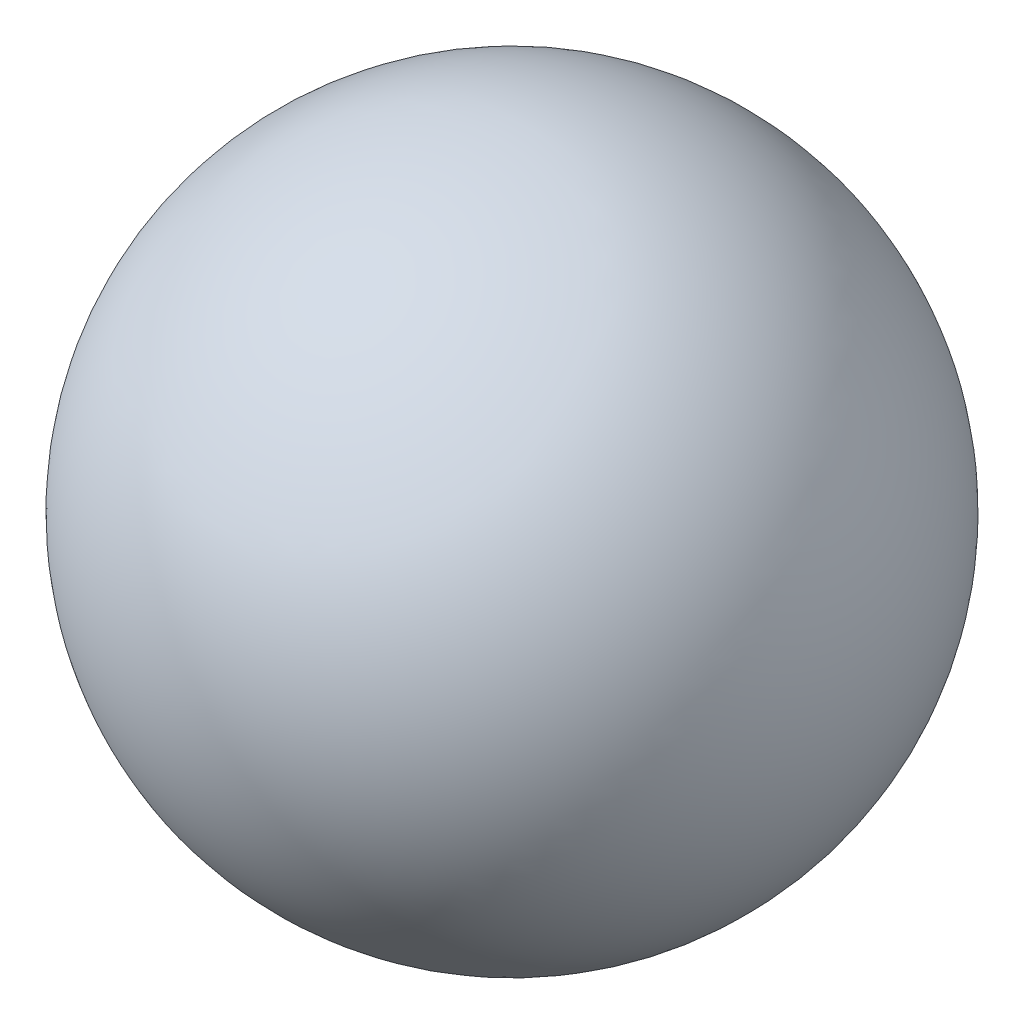
ISO-10303-21;
HEADER;
FILE_DESCRIPTION(('STEP AP214'),'2;1');
FILE_NAME('part.step','',(''),(''),'','','');
FILE_SCHEMA(('AUTOMOTIVE_DESIGN { 1 0 10303 214 1 1 1 1 }'));
ENDSEC;
DATA;
#1=APPLICATION_CONTEXT('core data for automotive mechanical design processes');
#2=APPLICATION_PROTOCOL_DEFINITION('international standard','automotive_design',2000,#1);
#3=PRODUCT_CONTEXT('',#1,'mechanical');
#4=PRODUCT('Part','Part','',(#3));
#5=PRODUCT_RELATED_PRODUCT_CATEGORY('part','',(#4));
#6=PRODUCT_DEFINITION_FORMATION('','',#4);
#7=PRODUCT_DEFINITION_CONTEXT('part definition',#1,'design');
#8=PRODUCT_DEFINITION('design','',#6,#7);
#9=PRODUCT_DEFINITION_SHAPE('','',#8);
#10=(LENGTH_UNIT() NAMED_UNIT(*) SI_UNIT(.MILLI.,.METRE.));
#11=(NAMED_UNIT(*) PLANE_ANGLE_UNIT() SI_UNIT($,.RADIAN.));
#12=(NAMED_UNIT(*) SI_UNIT($,.STERADIAN.) SOLID_ANGLE_UNIT());
#13=UNCERTAINTY_MEASURE_WITH_UNIT(LENGTH_MEASURE(1.E-05),#10,'distance_accuracy_value','');
#14=(GEOMETRIC_REPRESENTATION_CONTEXT(3) GLOBAL_UNCERTAINTY_ASSIGNED_CONTEXT((#13)) GLOBAL_UNIT_ASSIGNED_CONTEXT((#10,
#11,#12)) REPRESENTATION_CONTEXT('',''));
#15=CARTESIAN_POINT('',(0.,0.,0.));
#16=DIRECTION('',(0.,0.,1.));
#17=DIRECTION('',(1.,0.,0.));
#18=AXIS2_PLACEMENT_3D('',#15,#16,#17);
#19=CARTESIAN_POINT('',(0.,0.,0.));
#20=DIRECTION('',(0.,0.,-1.));
#21=DIRECTION('',(-1.,0.,0.));
#22=AXIS2_PLACEMENT_3D('',#19,#20,#21);
#23=SPHERICAL_SURFACE('',#22,110.);
#24=CARTESIAN_POINT('',(-2.53256958063672E-13,0.,-110.));
#25=VERTEX_POINT('',#24);
#26=VERTEX_LOOP('',#25);
#27=FACE_BOUND('',#26,.T.);
#28=ADVANCED_FACE('F30',(#27),#23,.T.);
#29=CLOSED_SHELL('',(#28));
#30=CARTESIAN_POINT('',(0.,0.,0.));
#31=DIRECTION('',(0.,0.,-1.));
#32=DIRECTION('',(1.,0.,0.));
#33=AXIS2_PLACEMENT_3D('',#30,#31,#32);
#34=SPHERICAL_SURFACE('',#33,105.);
#35=CARTESIAN_POINT('',(-2.41745278151687E-13,0.,-105.));
#36=VERTEX_POINT('',#35);
#37=VERTEX_LOOP('',#36);
#38=FACE_BOUND('',#37,.T.);
#39=ADVANCED_FACE('F43',(#38),#34,.F.);
#40=CLOSED_SHELL('',(#39));
#41=ORIENTED_CLOSED_SHELL('',*,#40,.T.);
#42=BREP_WITH_VOIDS('B2',#29,(#41));
#43=ADVANCED_BREP_SHAPE_REPRESENTATION('',(#18,#42),#14);
#44=SHAPE_DEFINITION_REPRESENTATION(#9,#43);
ENDSEC;
END-ISO-10303-21;
